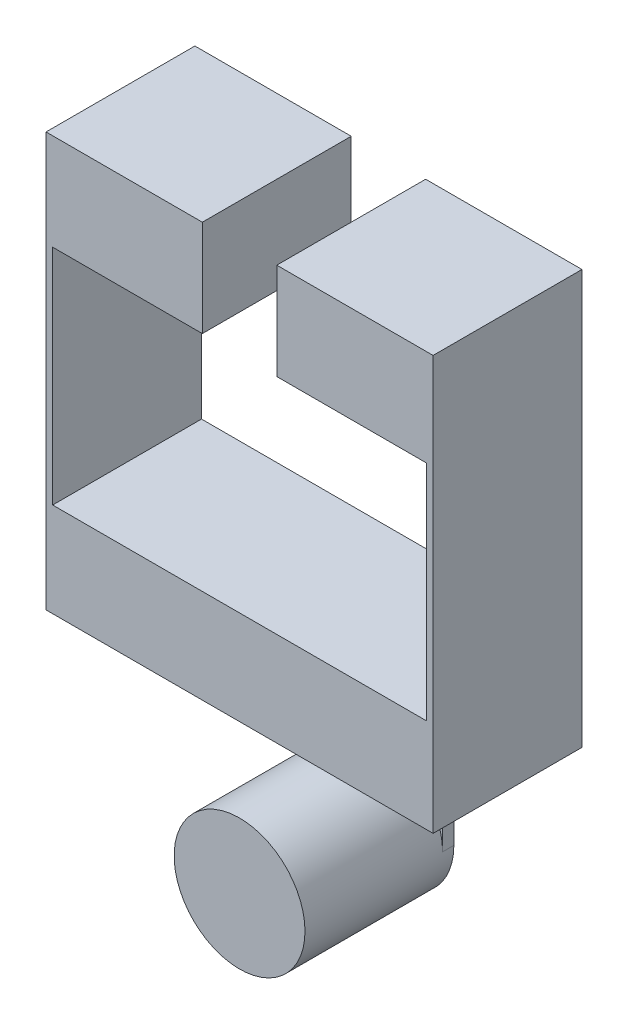
ISO-10303-21;
HEADER;
FILE_DESCRIPTION(('STEP AP214'),'2;1');
FILE_NAME('part.step','',(''),(''),'','','');
FILE_SCHEMA(('AUTOMOTIVE_DESIGN { 1 0 10303 214 1 1 1 1 }'));
ENDSEC;
DATA;
#1=APPLICATION_CONTEXT('core data for automotive mechanical design processes');
#2=APPLICATION_PROTOCOL_DEFINITION('international standard','automotive_design',2000,#1);
#3=PRODUCT_CONTEXT('',#1,'mechanical');
#4=PRODUCT('Part','Part','',(#3));
#5=PRODUCT_RELATED_PRODUCT_CATEGORY('part','',(#4));
#6=PRODUCT_DEFINITION_FORMATION('','',#4);
#7=PRODUCT_DEFINITION_CONTEXT('part definition',#1,'design');
#8=PRODUCT_DEFINITION('design','',#6,#7);
#9=PRODUCT_DEFINITION_SHAPE('','',#8);
#10=(LENGTH_UNIT() NAMED_UNIT(*) SI_UNIT(.MILLI.,.METRE.));
#11=(NAMED_UNIT(*) PLANE_ANGLE_UNIT() SI_UNIT($,.RADIAN.));
#12=(NAMED_UNIT(*) SI_UNIT($,.STERADIAN.) SOLID_ANGLE_UNIT());
#13=UNCERTAINTY_MEASURE_WITH_UNIT(LENGTH_MEASURE(1.E-05),#10,'distance_accuracy_value','');
#14=(GEOMETRIC_REPRESENTATION_CONTEXT(3) GLOBAL_UNCERTAINTY_ASSIGNED_CONTEXT((#13)) GLOBAL_UNIT_ASSIGNED_CONTEXT((#10,
#11,#12)) REPRESENTATION_CONTEXT('',''));
#15=CARTESIAN_POINT('',(0.,0.,0.));
#16=DIRECTION('',(0.,0.,1.));
#17=DIRECTION('',(1.,0.,0.));
#18=AXIS2_PLACEMENT_3D('',#15,#16,#17);
#19=CARTESIAN_POINT('',(0.,41.4643705136554,0.));
#20=DIRECTION('',(0.,-1.,0.));
#21=DIRECTION('',(0.,0.,-1.));
#22=AXIS2_PLACEMENT_3D('',#19,#20,#21);
#23=PLANE('',#22);
#24=DIRECTION('',(0.,0.,1.));
#25=VECTOR('',#24,1.);
#26=CARTESIAN_POINT('',(31.8903580164554,41.4643705136554,-25.4));
#27=LINE('',#26,#25);
#28=CARTESIAN_POINT('',(31.8903580164554,41.4643705136554,-25.4));
#29=VERTEX_POINT('',#28);
#30=CARTESIAN_POINT('',(31.8903580164554,41.4643705136554,0.));
#31=VERTEX_POINT('',#30);
#32=EDGE_CURVE('E61',#29,#31,#27,.T.);
#33=ORIENTED_EDGE('',*,*,#32,.F.);
#34=DIRECTION('',(-1.,0.,0.));
#35=VECTOR('',#34,1.);
#36=CARTESIAN_POINT('',(-33.02,41.4643705136554,-25.4));
#37=LINE('',#36,#35);
#38=CARTESIAN_POINT('',(-31.8903580164554,41.4643705136554,-25.4));
#39=VERTEX_POINT('',#38);
#40=EDGE_CURVE('E264',#29,#39,#37,.T.);
#41=ORIENTED_EDGE('',*,*,#40,.T.);
#42=DIRECTION('',(0.,0.,-1.));
#43=VECTOR('',#42,1.);
#44=CARTESIAN_POINT('',(-31.8903580164554,41.4643705136554,-25.4));
#45=LINE('',#44,#43);
#46=CARTESIAN_POINT('',(-31.8903580164554,41.4643705136554,0.));
#47=VERTEX_POINT('',#46);
#48=EDGE_CURVE('E245',#47,#39,#45,.T.);
#49=ORIENTED_EDGE('',*,*,#48,.F.);
#50=DIRECTION('',(1.,0.,0.));
#51=VECTOR('',#50,1.);
#52=CARTESIAN_POINT('',(-33.02,41.4643705136554,0.));
#53=LINE('',#52,#51);
#54=EDGE_CURVE('E66',#47,#31,#53,.T.);
#55=ORIENTED_EDGE('',*,*,#54,.T.);
#56=EDGE_LOOP('',(#33,#41,#49,#55));
#57=FACE_BOUND('',#56,.T.);
#58=ADVANCED_FACE('F45',(#57),#23,.F.);
#59=CARTESIAN_POINT('',(0.,0.,-25.4));
#60=DIRECTION('',(0.,0.,1.));
#61=DIRECTION('',(1.,0.,0.));
#62=AXIS2_PLACEMENT_3D('',#59,#60,#61);
#63=CYLINDRICAL_SURFACE('',#62,11.1628049548617);
#64=DIRECTION('',(0.,0.,-1.));
#65=VECTOR('',#64,1.);
#66=CARTESIAN_POINT('',(11.1628049548617,0.,-23.4735684489951));
#67=LINE('',#66,#65);
#68=CARTESIAN_POINT('',(11.1628049548617,0.,-23.4735684489951));
#69=VERTEX_POINT('',#68);
#70=CARTESIAN_POINT('',(11.1628049548617,0.,-25.4));
#71=VERTEX_POINT('',#70);
#72=EDGE_CURVE('E321',#69,#71,#67,.T.);
#73=ORIENTED_EDGE('',*,*,#72,.F.);
#74=CARTESIAN_POINT('',(0.,0.,-23.4735684489951));
#75=DIRECTION('',(0.,0.,1.));
#76=DIRECTION('',(-1.,0.,0.));
#77=AXIS2_PLACEMENT_3D('',#74,#75,#76);
#78=CIRCLE('',#77,11.1628049548617);
#79=CARTESIAN_POINT('',(-11.1628049548617,0.,-23.4735684489951));
#80=VERTEX_POINT('',#79);
#81=EDGE_CURVE('E298',#69,#80,#78,.T.);
#82=ORIENTED_EDGE('',*,*,#81,.T.);
#83=DIRECTION('',(0.,0.,-1.));
#84=VECTOR('',#83,1.);
#85=CARTESIAN_POINT('',(-11.1628049548617,0.,-23.4735684489951));
#86=LINE('',#85,#84);
#87=CARTESIAN_POINT('',(-11.1628049548617,0.,-25.4));
#88=VERTEX_POINT('',#87);
#89=EDGE_CURVE('E314',#80,#88,#86,.T.);
#90=ORIENTED_EDGE('',*,*,#89,.T.);
#91=CARTESIAN_POINT('',(0.,0.,-25.4));
#92=DIRECTION('',(0.,0.,1.));
#93=DIRECTION('',(1.,0.,0.));
#94=AXIS2_PLACEMENT_3D('',#91,#92,#93);
#95=CIRCLE('',#94,11.1628049548617);
#96=EDGE_CURVE('E11',#88,#71,#95,.T.);
#97=ORIENTED_EDGE('',*,*,#96,.T.);
#98=EDGE_LOOP('',(#73,#82,#90,#97));
#99=FACE_BOUND('',#98,.T.);
#100=CARTESIAN_POINT('',(0.,0.,0.));
#101=DIRECTION('',(0.,0.,1.));
#102=DIRECTION('',(1.,0.,0.));
#103=AXIS2_PLACEMENT_3D('',#100,#101,#102);
#104=CIRCLE('',#103,11.1628049548617);
#105=CARTESIAN_POINT('',(11.1628049548617,0.,0.));
#106=VERTEX_POINT('',#105);
#107=EDGE_CURVE('E49',#106,#106,#104,.T.);
#108=ORIENTED_EDGE('',*,*,#107,.F.);
#109=EDGE_LOOP('',(#108));
#110=FACE_BOUND('',#109,.T.);
#111=ADVANCED_FACE('F47',(#99,#110),#63,.T.);
#112=CARTESIAN_POINT('',(0.,0.,-25.4));
#113=DIRECTION('',(0.,0.,1.));
#114=DIRECTION('',(1.,0.,0.));
#115=AXIS2_PLACEMENT_3D('',#112,#113,#114);
#116=PLANE('',#115);
#117=ORIENTED_EDGE('',*,*,#96,.F.);
#118=DIRECTION('',(0.,1.,0.));
#119=VECTOR('',#118,1.);
#120=CARTESIAN_POINT('',(-11.1628049548617,25.4,-25.4));
#121=LINE('',#120,#119);
#122=CARTESIAN_POINT('',(-11.1628049548617,25.4,-25.4));
#123=VERTEX_POINT('',#122);
#124=EDGE_CURVE('E297',#88,#123,#121,.T.);
#125=ORIENTED_EDGE('',*,*,#124,.T.);
#126=DIRECTION('',(-1.,0.,0.));
#127=VECTOR('',#126,1.);
#128=CARTESIAN_POINT('',(-33.02,25.4,-25.4));
#129=LINE('',#128,#127);
#130=CARTESIAN_POINT('',(-33.02,25.4,-25.4));
#131=VERTEX_POINT('',#130);
#132=EDGE_CURVE('E278',#123,#131,#129,.T.);
#133=ORIENTED_EDGE('',*,*,#132,.T.);
#134=DIRECTION('',(0.,-1.,0.));
#135=VECTOR('',#134,1.);
#136=CARTESIAN_POINT('',(-33.02,41.4643705136554,-25.4));
#137=LINE('',#136,#135);
#138=CARTESIAN_POINT('',(-33.02,96.0254518876114,-25.4));
#139=VERTEX_POINT('',#138);
#140=EDGE_CURVE('E268',#139,#131,#137,.T.);
#141=ORIENTED_EDGE('',*,*,#140,.F.);
#142=DIRECTION('',(-1.,0.,0.));
#143=VECTOR('',#142,1.);
#144=CARTESIAN_POINT('',(-33.02,96.0254518876114,-25.4));
#145=LINE('',#144,#143);
#146=CARTESIAN_POINT('',(-6.34999999999999,96.0254518876114,-25.4));
#147=VERTEX_POINT('',#146);
#148=EDGE_CURVE('E176',#147,#139,#145,.T.);
#149=ORIENTED_EDGE('',*,*,#148,.F.);
#150=DIRECTION('',(0.,-1.,0.));
#151=VECTOR('',#150,1.);
#152=CARTESIAN_POINT('',(-6.34999999999999,96.0254518876114,-25.4));
#153=LINE('',#152,#151);
#154=CARTESIAN_POINT('',(-6.34999999999999,79.5643705136554,-25.4));
#155=VERTEX_POINT('',#154);
#156=EDGE_CURVE('E160',#147,#155,#153,.T.);
#157=ORIENTED_EDGE('',*,*,#156,.T.);
#158=DIRECTION('',(-1.,0.,0.));
#159=VECTOR('',#158,1.);
#160=CARTESIAN_POINT('',(-33.02,79.5643705136554,-25.4));
#161=LINE('',#160,#159);
#162=CARTESIAN_POINT('',(-31.8903580164554,79.5643705136554,-25.4));
#163=VERTEX_POINT('',#162);
#164=EDGE_CURVE('E169',#155,#163,#161,.T.);
#165=ORIENTED_EDGE('',*,*,#164,.T.);
#166=DIRECTION('',(0.,-1.,0.));
#167=VECTOR('',#166,1.);
#168=CARTESIAN_POINT('',(-31.8903580164554,79.5643705136554,-25.4));
#169=LINE('',#168,#167);
#170=EDGE_CURVE('E251',#163,#39,#169,.T.);
#171=ORIENTED_EDGE('',*,*,#170,.T.);
#172=ORIENTED_EDGE('',*,*,#40,.F.);
#173=DIRECTION('',(0.,-1.,0.));
#174=VECTOR('',#173,1.);
#175=CARTESIAN_POINT('',(31.8903580164554,79.5643705136554,-25.4));
#176=LINE('',#175,#174);
#177=CARTESIAN_POINT('',(31.8903580164554,79.5643705136554,-25.4));
#178=VERTEX_POINT('',#177);
#179=EDGE_CURVE('E234',#178,#29,#176,.T.);
#180=ORIENTED_EDGE('',*,*,#179,.F.);
#181=DIRECTION('',(-1.,0.,0.));
#182=VECTOR('',#181,1.);
#183=CARTESIAN_POINT('',(33.02,79.5643705136554,-25.4));
#184=LINE('',#183,#182);
#185=CARTESIAN_POINT('',(6.34999999999999,79.5643705136554,-25.4));
#186=VERTEX_POINT('',#185);
#187=EDGE_CURVE('E195',#178,#186,#184,.T.);
#188=ORIENTED_EDGE('',*,*,#187,.T.);
#189=DIRECTION('',(0.,-1.,0.));
#190=VECTOR('',#189,1.);
#191=CARTESIAN_POINT('',(6.34999999999999,96.0254518876114,-25.4));
#192=LINE('',#191,#190);
#193=CARTESIAN_POINT('',(6.34999999999999,96.0254518876114,-25.4));
#194=VERTEX_POINT('',#193);
#195=EDGE_CURVE('E230',#194,#186,#192,.T.);
#196=ORIENTED_EDGE('',*,*,#195,.F.);
#197=DIRECTION('',(-1.,0.,0.));
#198=VECTOR('',#197,1.);
#199=CARTESIAN_POINT('',(33.02,96.0254518876114,-25.4));
#200=LINE('',#199,#198);
#201=CARTESIAN_POINT('',(33.02,96.0254518876114,-25.4));
#202=VERTEX_POINT('',#201);
#203=EDGE_CURVE('E207',#202,#194,#200,.T.);
#204=ORIENTED_EDGE('',*,*,#203,.F.);
#205=DIRECTION('',(0.,-1.,0.));
#206=VECTOR('',#205,1.);
#207=CARTESIAN_POINT('',(33.02,41.4643705136554,-25.4));
#208=LINE('',#207,#206);
#209=CARTESIAN_POINT('',(33.02,25.4,-25.4));
#210=VERTEX_POINT('',#209);
#211=EDGE_CURVE('E285',#202,#210,#208,.T.);
#212=ORIENTED_EDGE('',*,*,#211,.T.);
#213=CARTESIAN_POINT('',(11.1628049548617,25.4,-25.4));
#214=VERTEX_POINT('',#213);
#215=EDGE_CURVE('E265',#210,#214,#129,.T.);
#216=ORIENTED_EDGE('',*,*,#215,.T.);
#217=DIRECTION('',(0.,-1.,0.));
#218=VECTOR('',#217,1.);
#219=CARTESIAN_POINT('',(11.1628049548617,0.,-25.4));
#220=LINE('',#219,#218);
#221=EDGE_CURVE('E302',#214,#71,#220,.T.);
#222=ORIENTED_EDGE('',*,*,#221,.T.);
#223=EDGE_LOOP('',(#117,#125,#133,#141,#149,#157,#165,#171,#172,#180,#188,#196,#204,#212,#216,#222));
#224=FACE_BOUND('',#223,.T.);
#225=ADVANCED_FACE('F173',(#224),#116,.F.);
#226=CARTESIAN_POINT('',(0.,0.,0.));
#227=DIRECTION('',(0.,0.,1.));
#228=DIRECTION('',(1.,0.,0.));
#229=AXIS2_PLACEMENT_3D('',#226,#227,#228);
#230=PLANE('',#229);
#231=ORIENTED_EDGE('',*,*,#107,.T.);
#232=EDGE_LOOP('',(#231));
#233=FACE_BOUND('',#232,.T.);
#234=ADVANCED_FACE('F530',(#233),#230,.T.);
#235=CARTESIAN_POINT('',(11.1628049548617,0.,-23.4735684489951));
#236=DIRECTION('',(1.,0.,0.));
#237=DIRECTION('',(0.,1.,0.));
#238=AXIS2_PLACEMENT_3D('',#235,#236,#237);
#239=PLANE('',#238);
#240=ORIENTED_EDGE('',*,*,#221,.F.);
#241=DIRECTION('',(0.,0.,-1.));
#242=VECTOR('',#241,1.);
#243=CARTESIAN_POINT('',(11.1628049548617,25.4,-23.4735684489951));
#244=LINE('',#243,#242);
#245=CARTESIAN_POINT('',(11.1628049548617,25.4,-23.4735684489951));
#246=VERTEX_POINT('',#245);
#247=EDGE_CURVE('E325',#246,#214,#244,.T.);
#248=ORIENTED_EDGE('',*,*,#247,.F.);
#249=DIRECTION('',(0.,-1.,0.));
#250=VECTOR('',#249,1.);
#251=CARTESIAN_POINT('',(11.1628049548617,0.,-23.4735684489951));
#252=LINE('',#251,#250);
#253=EDGE_CURVE('E310',#246,#69,#252,.T.);
#254=ORIENTED_EDGE('',*,*,#253,.T.);
#255=ORIENTED_EDGE('',*,*,#72,.T.);
#256=EDGE_LOOP('',(#240,#248,#254,#255));
#257=FACE_BOUND('',#256,.T.);
#258=ADVANCED_FACE('F382',(#257),#239,.T.);
#259=CARTESIAN_POINT('',(-11.1628049548617,25.4,-23.4735684489951));
#260=DIRECTION('',(-1.,0.,0.));
#261=DIRECTION('',(0.,0.,1.));
#262=AXIS2_PLACEMENT_3D('',#259,#260,#261);
#263=PLANE('',#262);
#264=ORIENTED_EDGE('',*,*,#124,.F.);
#265=ORIENTED_EDGE('',*,*,#89,.F.);
#266=DIRECTION('',(0.,1.,0.));
#267=VECTOR('',#266,1.);
#268=CARTESIAN_POINT('',(-11.1628049548617,25.4,-23.4735684489951));
#269=LINE('',#268,#267);
#270=CARTESIAN_POINT('',(-11.1628049548617,25.4,-23.4735684489951));
#271=VERTEX_POINT('',#270);
#272=EDGE_CURVE('E301',#80,#271,#269,.T.);
#273=ORIENTED_EDGE('',*,*,#272,.T.);
#274=DIRECTION('',(0.,0.,-1.));
#275=VECTOR('',#274,1.);
#276=CARTESIAN_POINT('',(-11.1628049548617,25.4,-23.4735684489951));
#277=LINE('',#276,#275);
#278=EDGE_CURVE('E329',#271,#123,#277,.T.);
#279=ORIENTED_EDGE('',*,*,#278,.T.);
#280=EDGE_LOOP('',(#264,#265,#273,#279));
#281=FACE_BOUND('',#280,.T.);
#282=ADVANCED_FACE('F341',(#281),#263,.T.);
#283=CARTESIAN_POINT('',(0.,0.,-23.4735684489951));
#284=DIRECTION('',(0.,0.,-1.));
#285=DIRECTION('',(-1.,0.,0.));
#286=AXIS2_PLACEMENT_3D('',#283,#284,#285);
#287=PLANE('',#286);
#288=ORIENTED_EDGE('',*,*,#81,.F.);
#289=ORIENTED_EDGE('',*,*,#253,.F.);
#290=DIRECTION('',(1.,0.,0.));
#291=VECTOR('',#290,1.);
#292=CARTESIAN_POINT('',(11.1628049548617,25.4,-23.4735684489951));
#293=LINE('',#292,#291);
#294=EDGE_CURVE('E306',#271,#246,#293,.T.);
#295=ORIENTED_EDGE('',*,*,#294,.F.);
#296=ORIENTED_EDGE('',*,*,#272,.F.);
#297=EDGE_LOOP('',(#288,#289,#295,#296));
#298=FACE_BOUND('',#297,.T.);
#299=ADVANCED_FACE('F384',(#298),#287,.F.);
#300=CARTESIAN_POINT('',(0.,25.4,0.));
#301=DIRECTION('',(0.,-1.,0.));
#302=DIRECTION('',(0.,0.,-1.));
#303=AXIS2_PLACEMENT_3D('',#300,#301,#302);
#304=PLANE('',#303);
#305=ORIENTED_EDGE('',*,*,#278,.F.);
#306=ORIENTED_EDGE('',*,*,#294,.T.);
#307=ORIENTED_EDGE('',*,*,#247,.T.);
#308=ORIENTED_EDGE('',*,*,#215,.F.);
#309=DIRECTION('',(0.,0.,-1.));
#310=VECTOR('',#309,1.);
#311=CARTESIAN_POINT('',(33.02,25.4,0.));
#312=LINE('',#311,#310);
#313=CARTESIAN_POINT('',(33.02,25.4,0.));
#314=VERTEX_POINT('',#313);
#315=EDGE_CURVE('E275',#314,#210,#312,.T.);
#316=ORIENTED_EDGE('',*,*,#315,.F.);
#317=DIRECTION('',(1.,0.,0.));
#318=VECTOR('',#317,1.);
#319=CARTESIAN_POINT('',(-33.02,25.4,0.));
#320=LINE('',#319,#318);
#321=CARTESIAN_POINT('',(-33.02,25.4,0.));
#322=VERTEX_POINT('',#321);
#323=EDGE_CURVE('E272',#322,#314,#320,.T.);
#324=ORIENTED_EDGE('',*,*,#323,.F.);
#325=DIRECTION('',(0.,0.,1.));
#326=VECTOR('',#325,1.);
#327=CARTESIAN_POINT('',(-33.02,25.4,0.));
#328=LINE('',#327,#326);
#329=EDGE_CURVE('E261',#131,#322,#328,.T.);
#330=ORIENTED_EDGE('',*,*,#329,.F.);
#331=ORIENTED_EDGE('',*,*,#132,.F.);
#332=EDGE_LOOP('',(#305,#306,#307,#308,#316,#324,#330,#331));
#333=FACE_BOUND('',#332,.T.);
#334=ADVANCED_FACE('F346',(#333),#304,.T.);
#335=CARTESIAN_POINT('',(-33.02,41.4643705136554,0.));
#336=DIRECTION('',(1.,0.,0.));
#337=DIRECTION('',(0.,0.,-1.));
#338=AXIS2_PLACEMENT_3D('',#335,#336,#337);
#339=PLANE('',#338);
#340=ORIENTED_EDGE('',*,*,#329,.T.);
#341=DIRECTION('',(0.,-1.,0.));
#342=VECTOR('',#341,1.);
#343=CARTESIAN_POINT('',(-33.02,41.4643705136554,0.));
#344=LINE('',#343,#342);
#345=CARTESIAN_POINT('',(-33.02,96.0254518876114,0.));
#346=VERTEX_POINT('',#345);
#347=EDGE_CURVE('E293',#346,#322,#344,.T.);
#348=ORIENTED_EDGE('',*,*,#347,.F.);
#349=DIRECTION('',(0.,0.,1.));
#350=VECTOR('',#349,1.);
#351=CARTESIAN_POINT('',(-33.02,96.0254518876114,0.));
#352=LINE('',#351,#350);
#353=EDGE_CURVE('E178',#139,#346,#352,.T.);
#354=ORIENTED_EDGE('',*,*,#353,.F.);
#355=ORIENTED_EDGE('',*,*,#140,.T.);
#356=EDGE_LOOP('',(#340,#348,#354,#355));
#357=FACE_BOUND('',#356,.T.);
#358=ADVANCED_FACE('F350',(#357),#339,.F.);
#359=CARTESIAN_POINT('',(-33.02,41.4643705136554,0.));
#360=DIRECTION('',(0.,0.,-1.));
#361=DIRECTION('',(-1.,0.,0.));
#362=AXIS2_PLACEMENT_3D('',#359,#360,#361);
#363=PLANE('',#362);
#364=ORIENTED_EDGE('',*,*,#323,.T.);
#365=DIRECTION('',(0.,-1.,0.));
#366=VECTOR('',#365,1.);
#367=CARTESIAN_POINT('',(33.02,41.4643705136554,0.));
#368=LINE('',#367,#366);
#369=CARTESIAN_POINT('',(33.02,96.0254518876114,0.));
#370=VERTEX_POINT('',#369);
#371=EDGE_CURVE('E289',#370,#314,#368,.T.);
#372=ORIENTED_EDGE('',*,*,#371,.F.);
#373=DIRECTION('',(1.,0.,0.));
#374=VECTOR('',#373,1.);
#375=CARTESIAN_POINT('',(33.02,96.0254518876114,0.));
#376=LINE('',#375,#374);
#377=CARTESIAN_POINT('',(6.34999999999999,96.0254518876114,0.));
#378=VERTEX_POINT('',#377);
#379=EDGE_CURVE('E214',#378,#370,#376,.T.);
#380=ORIENTED_EDGE('',*,*,#379,.F.);
#381=DIRECTION('',(0.,-1.,0.));
#382=VECTOR('',#381,1.);
#383=CARTESIAN_POINT('',(6.34999999999999,96.0254518876114,0.));
#384=LINE('',#383,#382);
#385=CARTESIAN_POINT('',(6.34999999999999,79.5643705136554,0.));
#386=VERTEX_POINT('',#385);
#387=EDGE_CURVE('E218',#378,#386,#384,.T.);
#388=ORIENTED_EDGE('',*,*,#387,.T.);
#389=DIRECTION('',(1.,0.,0.));
#390=VECTOR('',#389,1.);
#391=CARTESIAN_POINT('',(33.02,79.5643705136554,0.));
#392=LINE('',#391,#390);
#393=CARTESIAN_POINT('',(31.8903580164554,79.5643705136554,0.));
#394=VERTEX_POINT('',#393);
#395=EDGE_CURVE('E208',#386,#394,#392,.T.);
#396=ORIENTED_EDGE('',*,*,#395,.T.);
#397=DIRECTION('',(0.,-1.,0.));
#398=VECTOR('',#397,1.);
#399=CARTESIAN_POINT('',(31.8903580164554,79.5643705136554,0.));
#400=LINE('',#399,#398);
#401=EDGE_CURVE('E238',#394,#31,#400,.T.);
#402=ORIENTED_EDGE('',*,*,#401,.T.);
#403=ORIENTED_EDGE('',*,*,#54,.F.);
#404=DIRECTION('',(0.,-1.,0.));
#405=VECTOR('',#404,1.);
#406=CARTESIAN_POINT('',(-31.8903580164554,79.5643705136554,0.));
#407=LINE('',#406,#405);
#408=CARTESIAN_POINT('',(-31.8903580164554,79.5643705136554,0.));
#409=VERTEX_POINT('',#408);
#410=EDGE_CURVE('E257',#409,#47,#407,.T.);
#411=ORIENTED_EDGE('',*,*,#410,.F.);
#412=DIRECTION('',(1.,0.,0.));
#413=VECTOR('',#412,1.);
#414=CARTESIAN_POINT('',(-33.02,79.5643705136554,0.));
#415=LINE('',#414,#413);
#416=CARTESIAN_POINT('',(-6.34999999999999,79.5643705136554,0.));
#417=VERTEX_POINT('',#416);
#418=EDGE_CURVE('E168',#409,#417,#415,.T.);
#419=ORIENTED_EDGE('',*,*,#418,.T.);
#420=DIRECTION('',(0.,-1.,0.));
#421=VECTOR('',#420,1.);
#422=CARTESIAN_POINT('',(-6.34999999999999,96.0254518876114,0.));
#423=LINE('',#422,#421);
#424=CARTESIAN_POINT('',(-6.34999999999999,96.0254518876114,0.));
#425=VERTEX_POINT('',#424);
#426=EDGE_CURVE('E163',#425,#417,#423,.T.);
#427=ORIENTED_EDGE('',*,*,#426,.F.);
#428=DIRECTION('',(1.,0.,0.));
#429=VECTOR('',#428,1.);
#430=CARTESIAN_POINT('',(-33.02,96.0254518876114,0.));
#431=LINE('',#430,#429);
#432=EDGE_CURVE('E185',#346,#425,#431,.T.);
#433=ORIENTED_EDGE('',*,*,#432,.F.);
#434=ORIENTED_EDGE('',*,*,#347,.T.);
#435=EDGE_LOOP('',(#364,#372,#380,#388,#396,#402,#403,#411,#419,#427,#433,#434));
#436=FACE_BOUND('',#435,.T.);
#437=ADVANCED_FACE('F356',(#436),#363,.F.);
#438=CARTESIAN_POINT('',(33.02,41.4643705136554,0.));
#439=DIRECTION('',(-1.,0.,0.));
#440=DIRECTION('',(0.,0.,1.));
#441=AXIS2_PLACEMENT_3D('',#438,#439,#440);
#442=PLANE('',#441);
#443=ORIENTED_EDGE('',*,*,#315,.T.);
#444=ORIENTED_EDGE('',*,*,#211,.F.);
#445=DIRECTION('',(0.,0.,-1.));
#446=VECTOR('',#445,1.);
#447=CARTESIAN_POINT('',(33.02,96.0254518876114,0.));
#448=LINE('',#447,#446);
#449=EDGE_CURVE('E203',#370,#202,#448,.T.);
#450=ORIENTED_EDGE('',*,*,#449,.F.);
#451=ORIENTED_EDGE('',*,*,#371,.T.);
#452=EDGE_LOOP('',(#443,#444,#450,#451));
#453=FACE_BOUND('',#452,.T.);
#454=ADVANCED_FACE('F404',(#453),#442,.F.);
#455=CARTESIAN_POINT('',(-31.8903580164554,79.5643705136554,-25.4));
#456=DIRECTION('',(-1.,0.,0.));
#457=DIRECTION('',(0.,0.,1.));
#458=AXIS2_PLACEMENT_3D('',#455,#456,#457);
#459=PLANE('',#458);
#460=ORIENTED_EDGE('',*,*,#48,.T.);
#461=ORIENTED_EDGE('',*,*,#170,.F.);
#462=DIRECTION('',(0.,0.,-1.));
#463=VECTOR('',#462,1.);
#464=CARTESIAN_POINT('',(-31.8903580164554,79.5643705136554,-25.4));
#465=LINE('',#464,#463);
#466=EDGE_CURVE('E183',#409,#163,#465,.T.);
#467=ORIENTED_EDGE('',*,*,#466,.F.);
#468=ORIENTED_EDGE('',*,*,#410,.T.);
#469=EDGE_LOOP('',(#460,#461,#467,#468));
#470=FACE_BOUND('',#469,.T.);
#471=ADVANCED_FACE('F359',(#470),#459,.F.);
#472=CARTESIAN_POINT('',(31.8903580164554,79.5643705136554,-25.4));
#473=DIRECTION('',(1.,0.,0.));
#474=DIRECTION('',(0.,0.,-1.));
#475=AXIS2_PLACEMENT_3D('',#472,#473,#474);
#476=PLANE('',#475);
#477=ORIENTED_EDGE('',*,*,#32,.T.);
#478=ORIENTED_EDGE('',*,*,#401,.F.);
#479=DIRECTION('',(0.,0.,1.));
#480=VECTOR('',#479,1.);
#481=CARTESIAN_POINT('',(31.8903580164554,79.5643705136554,-25.4));
#482=LINE('',#481,#480);
#483=EDGE_CURVE('E242',#178,#394,#482,.T.);
#484=ORIENTED_EDGE('',*,*,#483,.F.);
#485=ORIENTED_EDGE('',*,*,#179,.T.);
#486=EDGE_LOOP('',(#477,#478,#484,#485));
#487=FACE_BOUND('',#486,.T.);
#488=ADVANCED_FACE('F362',(#487),#476,.F.);
#489=CARTESIAN_POINT('',(0.,79.5643705136554,0.));
#490=DIRECTION('',(0.,1.,0.));
#491=DIRECTION('',(0.,0.,1.));
#492=AXIS2_PLACEMENT_3D('',#489,#490,#491);
#493=PLANE('',#492);
#494=ORIENTED_EDGE('',*,*,#187,.F.);
#495=ORIENTED_EDGE('',*,*,#483,.T.);
#496=ORIENTED_EDGE('',*,*,#395,.F.);
#497=DIRECTION('',(0.,0.,1.));
#498=VECTOR('',#497,1.);
#499=CARTESIAN_POINT('',(6.34999999999999,79.5643705136554,0.));
#500=LINE('',#499,#498);
#501=EDGE_CURVE('E221',#186,#386,#500,.T.);
#502=ORIENTED_EDGE('',*,*,#501,.F.);
#503=EDGE_LOOP('',(#494,#495,#496,#502));
#504=FACE_BOUND('',#503,.T.);
#505=ADVANCED_FACE('F367',(#504),#493,.F.);
#506=CARTESIAN_POINT('',(6.34999999999999,96.0254518876114,0.));
#507=DIRECTION('',(1.,0.,0.));
#508=DIRECTION('',(0.,0.,-1.));
#509=AXIS2_PLACEMENT_3D('',#506,#507,#508);
#510=PLANE('',#509);
#511=ORIENTED_EDGE('',*,*,#501,.T.);
#512=ORIENTED_EDGE('',*,*,#387,.F.);
#513=DIRECTION('',(0.,0.,1.));
#514=VECTOR('',#513,1.);
#515=CARTESIAN_POINT('',(6.34999999999999,96.0254518876114,0.));
#516=LINE('',#515,#514);
#517=EDGE_CURVE('E211',#194,#378,#516,.T.);
#518=ORIENTED_EDGE('',*,*,#517,.F.);
#519=ORIENTED_EDGE('',*,*,#195,.T.);
#520=EDGE_LOOP('',(#511,#512,#518,#519));
#521=FACE_BOUND('',#520,.T.);
#522=ADVANCED_FACE('F372',(#521),#510,.F.);
#523=CARTESIAN_POINT('',(0.,96.0254518876114,0.));
#524=DIRECTION('',(0.,1.,0.));
#525=DIRECTION('',(0.,0.,1.));
#526=AXIS2_PLACEMENT_3D('',#523,#524,#525);
#527=PLANE('',#526);
#528=ORIENTED_EDGE('',*,*,#449,.T.);
#529=ORIENTED_EDGE('',*,*,#203,.T.);
#530=ORIENTED_EDGE('',*,*,#517,.T.);
#531=ORIENTED_EDGE('',*,*,#379,.T.);
#532=EDGE_LOOP('',(#528,#529,#530,#531));
#533=FACE_BOUND('',#532,.T.);
#534=ADVANCED_FACE('F376',(#533),#527,.T.);
#535=CARTESIAN_POINT('',(0.,79.5643705136554,0.));
#536=DIRECTION('',(0.,1.,0.));
#537=DIRECTION('',(0.,0.,1.));
#538=AXIS2_PLACEMENT_3D('',#535,#536,#537);
#539=PLANE('',#538);
#540=ORIENTED_EDGE('',*,*,#418,.F.);
#541=ORIENTED_EDGE('',*,*,#466,.T.);
#542=ORIENTED_EDGE('',*,*,#164,.F.);
#543=DIRECTION('',(0.,0.,-1.));
#544=VECTOR('',#543,1.);
#545=CARTESIAN_POINT('',(-6.34999999999999,79.5643705136554,0.));
#546=LINE('',#545,#544);
#547=EDGE_CURVE('E157',#417,#155,#546,.T.);
#548=ORIENTED_EDGE('',*,*,#547,.F.);
#549=EDGE_LOOP('',(#540,#541,#542,#548));
#550=FACE_BOUND('',#549,.T.);
#551=ADVANCED_FACE('F181',(#550),#539,.F.);
#552=CARTESIAN_POINT('',(-6.34999999999999,96.0254518876114,0.));
#553=DIRECTION('',(-1.,0.,0.));
#554=DIRECTION('',(0.,0.,1.));
#555=AXIS2_PLACEMENT_3D('',#552,#553,#554);
#556=PLANE('',#555);
#557=ORIENTED_EDGE('',*,*,#547,.T.);
#558=ORIENTED_EDGE('',*,*,#156,.F.);
#559=DIRECTION('',(0.,0.,-1.));
#560=VECTOR('',#559,1.);
#561=CARTESIAN_POINT('',(-6.34999999999999,96.0254518876114,0.));
#562=LINE('',#561,#560);
#563=EDGE_CURVE('E189',#425,#147,#562,.T.);
#564=ORIENTED_EDGE('',*,*,#563,.F.);
#565=ORIENTED_EDGE('',*,*,#426,.T.);
#566=EDGE_LOOP('',(#557,#558,#564,#565));
#567=FACE_BOUND('',#566,.T.);
#568=ADVANCED_FACE('F159',(#567),#556,.F.);
#569=CARTESIAN_POINT('',(0.,96.0254518876114,0.));
#570=DIRECTION('',(0.,1.,0.));
#571=DIRECTION('',(0.,0.,1.));
#572=AXIS2_PLACEMENT_3D('',#569,#570,#571);
#573=PLANE('',#572);
#574=ORIENTED_EDGE('',*,*,#432,.T.);
#575=ORIENTED_EDGE('',*,*,#563,.T.);
#576=ORIENTED_EDGE('',*,*,#148,.T.);
#577=ORIENTED_EDGE('',*,*,#353,.T.);
#578=EDGE_LOOP('',(#574,#575,#576,#577));
#579=FACE_BOUND('',#578,.T.);
#580=ADVANCED_FACE('F353',(#579),#573,.T.);
#581=CLOSED_SHELL('',(#58,#111,#225,#234,#258,#282,#299,#334,#358,#437,#454,#471,#488,#505,#522,
#534,#551,#568,#580));
#582=MANIFOLD_SOLID_BREP('B2',#581);
#583=ADVANCED_BREP_SHAPE_REPRESENTATION('',(#18,#582),#14);
#584=SHAPE_DEFINITION_REPRESENTATION(#9,#583);
ENDSEC;
END-ISO-10303-21;
